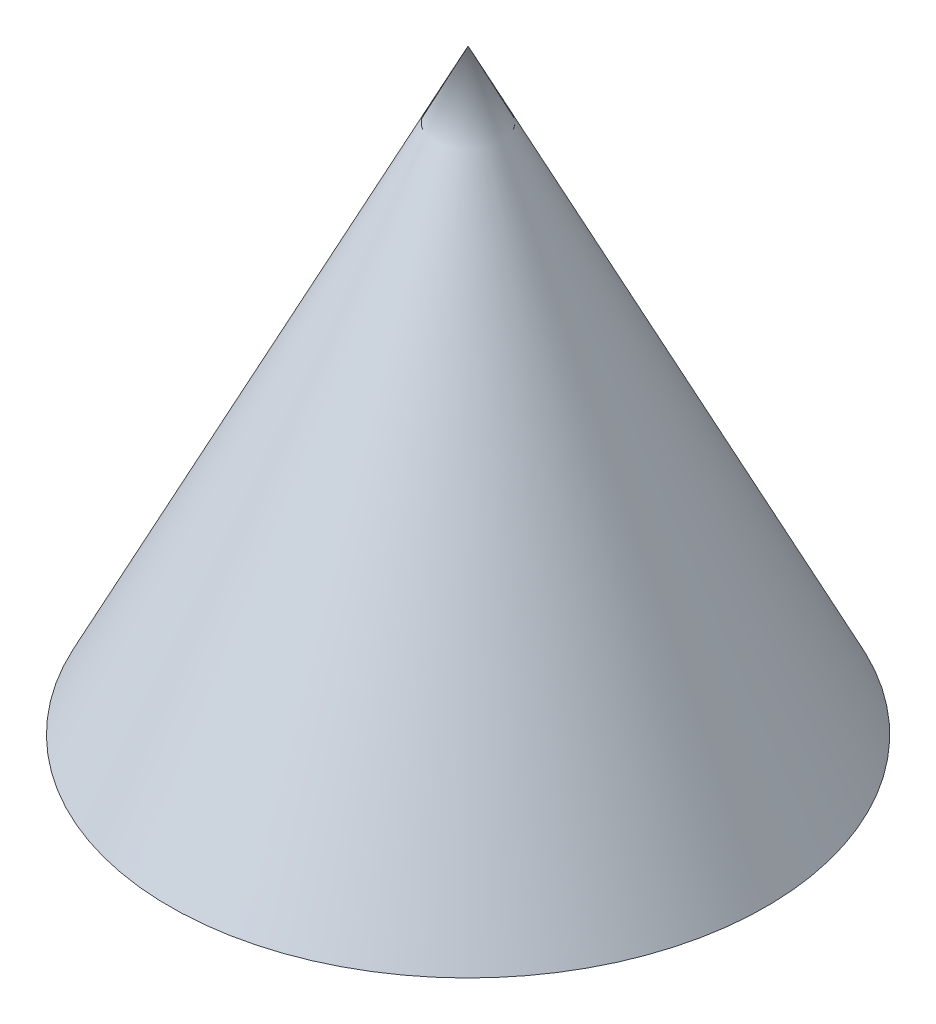
ISO-10303-21;
HEADER;
FILE_DESCRIPTION(('STEP AP214'),'2;1');
FILE_NAME('part.step','',(''),(''),'','','');
FILE_SCHEMA(('AUTOMOTIVE_DESIGN { 1 0 10303 214 1 1 1 1 }'));
ENDSEC;
DATA;
#1=APPLICATION_CONTEXT('core data for automotive mechanical design processes');
#2=APPLICATION_PROTOCOL_DEFINITION('international standard','automotive_design',2000,#1);
#3=PRODUCT_CONTEXT('',#1,'mechanical');
#4=PRODUCT('Part','Part','',(#3));
#5=PRODUCT_RELATED_PRODUCT_CATEGORY('part','',(#4));
#6=PRODUCT_DEFINITION_FORMATION('','',#4);
#7=PRODUCT_DEFINITION_CONTEXT('part definition',#1,'design');
#8=PRODUCT_DEFINITION('design','',#6,#7);
#9=PRODUCT_DEFINITION_SHAPE('','',#8);
#10=(LENGTH_UNIT() NAMED_UNIT(*) SI_UNIT(.MILLI.,.METRE.));
#11=(NAMED_UNIT(*) PLANE_ANGLE_UNIT() SI_UNIT($,.RADIAN.));
#12=(NAMED_UNIT(*) SI_UNIT($,.STERADIAN.) SOLID_ANGLE_UNIT());
#13=UNCERTAINTY_MEASURE_WITH_UNIT(LENGTH_MEASURE(1.E-05),#10,'distance_accuracy_value','');
#14=(GEOMETRIC_REPRESENTATION_CONTEXT(3) GLOBAL_UNCERTAINTY_ASSIGNED_CONTEXT((#13)) GLOBAL_UNIT_ASSIGNED_CONTEXT((#10,
#11,#12)) REPRESENTATION_CONTEXT('',''));
#15=CARTESIAN_POINT('',(0.,0.,0.));
#16=DIRECTION('',(0.,0.,1.));
#17=DIRECTION('',(1.,0.,0.));
#18=AXIS2_PLACEMENT_3D('',#15,#16,#17);
#19=CARTESIAN_POINT('',(0.,0.,0.));
#20=DIRECTION('',(0.,-1.,0.));
#21=DIRECTION('',(0.,0.,-1.));
#22=AXIS2_PLACEMENT_3D('',#19,#20,#21);
#23=CONICAL_SURFACE('',#22,5.,0.463647609000806);
#24=CARTESIAN_POINT('',(0.,10.,0.));
#25=VERTEX_POINT('',#24);
#26=VERTEX_LOOP('',#25);
#27=FACE_BOUND('',#26,.T.);
#28=CARTESIAN_POINT('',(0.,0.,0.));
#29=DIRECTION('',(0.,-1.,0.));
#30=DIRECTION('',(0.,0.,-1.));
#31=AXIS2_PLACEMENT_3D('',#28,#29,#30);
#32=CIRCLE('',#31,5.);
#33=CARTESIAN_POINT('',(0.,0.,-5.));
#34=VERTEX_POINT('',#33);
#35=EDGE_CURVE('E11',#34,#34,#32,.T.);
#36=ORIENTED_EDGE('',*,*,#35,.F.);
#37=EDGE_LOOP('',(#36));
#38=FACE_BOUND('',#37,.T.);
#39=ADVANCED_FACE('F35',(#27,#38),#23,.T.);
#40=CARTESIAN_POINT('',(0.,0.,0.));
#41=DIRECTION('',(0.,-1.,0.));
#42=DIRECTION('',(0.,0.,-1.));
#43=AXIS2_PLACEMENT_3D('',#40,#41,#42);
#44=PLANE('',#43);
#45=ORIENTED_EDGE('',*,*,#35,.T.);
#46=EDGE_LOOP('',(#45));
#47=FACE_BOUND('',#46,.T.);
#48=ADVANCED_FACE('F44',(#47),#44,.T.);
#49=CLOSED_SHELL('',(#39,#48));
#50=MANIFOLD_SOLID_BREP('B2',#49);
#51=ADVANCED_BREP_SHAPE_REPRESENTATION('',(#18,#50),#14);
#52=SHAPE_DEFINITION_REPRESENTATION(#9,#51);
ENDSEC;
END-ISO-10303-21;
